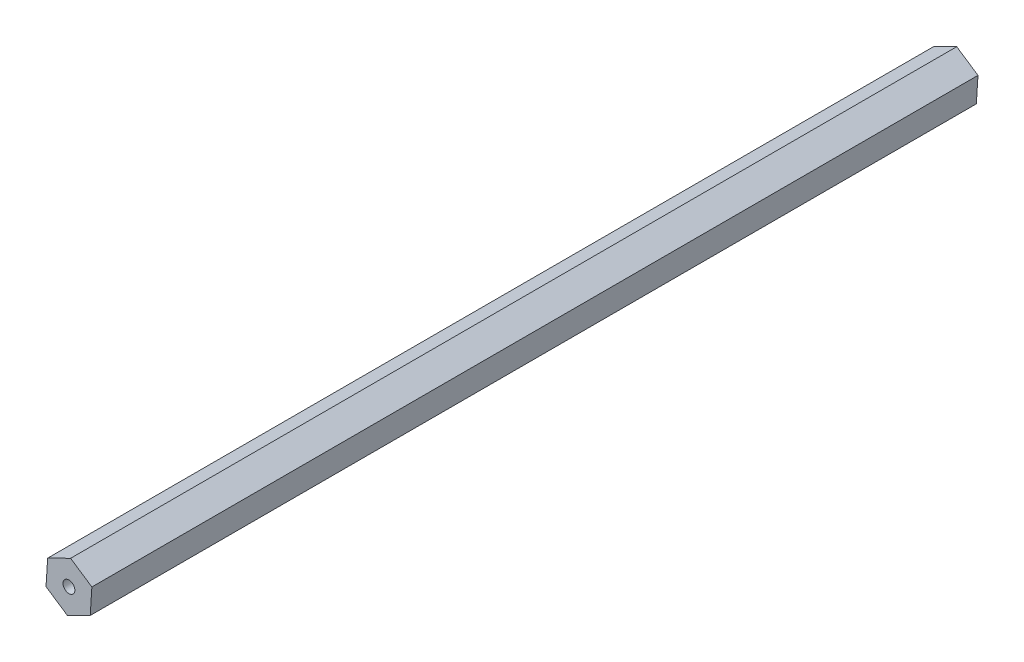
ISO-10303-21;
HEADER;
FILE_DESCRIPTION(('STEP AP214'),'2;1');
FILE_NAME('part.step','',(''),(''),'','','');
FILE_SCHEMA(('AUTOMOTIVE_DESIGN { 1 0 10303 214 1 1 1 1 }'));
ENDSEC;
DATA;
#1=APPLICATION_CONTEXT('core data for automotive mechanical design processes');
#2=APPLICATION_PROTOCOL_DEFINITION('international standard','automotive_design',2000,#1);
#3=PRODUCT_CONTEXT('',#1,'mechanical');
#4=PRODUCT('Part','Part','',(#3));
#5=PRODUCT_RELATED_PRODUCT_CATEGORY('part','',(#4));
#6=PRODUCT_DEFINITION_FORMATION('','',#4);
#7=PRODUCT_DEFINITION_CONTEXT('part definition',#1,'design');
#8=PRODUCT_DEFINITION('design','',#6,#7);
#9=PRODUCT_DEFINITION_SHAPE('','',#8);
#10=(LENGTH_UNIT() NAMED_UNIT(*) SI_UNIT(.MILLI.,.METRE.));
#11=(NAMED_UNIT(*) PLANE_ANGLE_UNIT() SI_UNIT($,.RADIAN.));
#12=(NAMED_UNIT(*) SI_UNIT($,.STERADIAN.) SOLID_ANGLE_UNIT());
#13=UNCERTAINTY_MEASURE_WITH_UNIT(LENGTH_MEASURE(1.E-05),#10,'distance_accuracy_value','');
#14=(GEOMETRIC_REPRESENTATION_CONTEXT(3) GLOBAL_UNCERTAINTY_ASSIGNED_CONTEXT((#13)) GLOBAL_UNIT_ASSIGNED_CONTEXT((#10,
#11,#12)) REPRESENTATION_CONTEXT('',''));
#15=CARTESIAN_POINT('',(0.,0.,0.));
#16=DIRECTION('',(0.,0.,1.));
#17=DIRECTION('',(1.,0.,0.));
#18=AXIS2_PLACEMENT_3D('',#15,#16,#17);
#19=CARTESIAN_POINT('',(0.,0.,300.));
#20=DIRECTION('',(0.,0.,-1.));
#21=DIRECTION('',(-1.,0.,0.));
#22=AXIS2_PLACEMENT_3D('',#19,#20,#21);
#23=CYLINDRICAL_SURFACE('',#22,2.);
#24=CARTESIAN_POINT('',(0.,0.,300.));
#25=DIRECTION('',(0.,0.,-1.));
#26=DIRECTION('',(-1.,0.,0.));
#27=AXIS2_PLACEMENT_3D('',#24,#25,#26);
#28=CIRCLE('',#27,2.);
#29=CARTESIAN_POINT('',(-2.,0.,300.));
#30=VERTEX_POINT('',#29);
#31=EDGE_CURVE('E98',#30,#30,#28,.T.);
#32=ORIENTED_EDGE('',*,*,#31,.F.);
#33=EDGE_LOOP('',(#32));
#34=FACE_BOUND('',#33,.T.);
#35=CARTESIAN_POINT('',(0.,0.,0.));
#36=DIRECTION('',(0.,0.,-1.));
#37=DIRECTION('',(-1.,0.,0.));
#38=AXIS2_PLACEMENT_3D('',#35,#36,#37);
#39=CIRCLE('',#38,2.);
#40=CARTESIAN_POINT('',(-2.,0.,0.));
#41=VERTEX_POINT('',#40);
#42=EDGE_CURVE('E20',#41,#41,#39,.T.);
#43=ORIENTED_EDGE('',*,*,#42,.T.);
#44=EDGE_LOOP('',(#43));
#45=FACE_BOUND('',#44,.T.);
#46=ADVANCED_FACE('F17',(#34,#45),#23,.F.);
#47=CARTESIAN_POINT('',(-7.765515754,-3.833636012,0.));
#48=DIRECTION('',(0.997886653761154,-0.0649786599228341,0.));
#49=DIRECTION('',(0.0649786599228341,0.997886653761154,0.));
#50=AXIS2_PLACEMENT_3D('',#47,#48,#49);
#51=PLANE('',#50);
#52=DIRECTION('',(-0.064978659977166,-0.997886653757616,0.));
#53=VECTOR('',#52,1.);
#54=CARTESIAN_POINT('',(-7.20278404931744,4.80831591617065,300.));
#55=LINE('',#54,#53);
#56=CARTESIAN_POINT('',(-7.20278405027703,4.80831591281217,300.));
#57=VERTEX_POINT('',#56);
#58=CARTESIAN_POINT('',(-7.76551575366513,-3.83363601404959,300.));
#59=VERTEX_POINT('',#58);
#60=EDGE_CURVE('E77',#57,#59,#55,.T.);
#61=ORIENTED_EDGE('',*,*,#60,.F.);
#62=DIRECTION('',(0.,0.,1.));
#63=VECTOR('',#62,1.);
#64=CARTESIAN_POINT('',(-7.20278404779069,4.80831591307803,0.));
#65=LINE('',#64,#63);
#66=CARTESIAN_POINT('',(-7.20278404989534,4.80831591203901,0.));
#67=VERTEX_POINT('',#66);
#68=EDGE_CURVE('E73',#57,#67,#65,.F.);
#69=ORIENTED_EDGE('',*,*,#68,.T.);
#70=DIRECTION('',(-0.0649786599228342,-0.997886653761154,0.));
#71=VECTOR('',#70,1.);
#72=CARTESIAN_POINT('',(-7.202784052,4.808315911,0.));
#73=LINE('',#72,#71);
#74=CARTESIAN_POINT('',(-7.76551575408766,-3.83363601334615,0.));
#75=VERTEX_POINT('',#74);
#76=EDGE_CURVE('E76',#67,#75,#73,.T.);
#77=ORIENTED_EDGE('',*,*,#76,.T.);
#78=DIRECTION('',(0.,0.,1.));
#79=VECTOR('',#78,1.);
#80=CARTESIAN_POINT('',(-7.765515754,-3.833636012,0.));
#81=LINE('',#80,#79);
#82=EDGE_CURVE('E67',#75,#59,#81,.T.);
#83=ORIENTED_EDGE('',*,*,#82,.T.);
#84=EDGE_LOOP('',(#61,#69,#77,#83));
#85=FACE_BOUND('',#84,.T.);
#86=ADVANCED_FACE('F75',(#85),#51,.F.);
#87=CARTESIAN_POINT('',(-0.562731702,-8.641951923,0.));
#88=DIRECTION('',(0.555216497113954,0.831705862268934,0.));
#89=DIRECTION('',(-0.831705862268934,0.555216497113954,0.));
#90=AXIS2_PLACEMENT_3D('',#87,#88,#89);
#91=PLANE('',#90);
#92=DIRECTION('',(0.831705862466919,-0.555216496817375,0.));
#93=VECTOR('',#92,1.);
#94=CARTESIAN_POINT('',(-7.76551575230988,-3.83363601481376,300.));
#95=LINE('',#94,#93);
#96=CARTESIAN_POINT('',(-0.562731703165504,-8.64195192171506,300.));
#97=VERTEX_POINT('',#96);
#98=EDGE_CURVE('E103',#59,#97,#95,.T.);
#99=ORIENTED_EDGE('',*,*,#98,.F.);
#100=ORIENTED_EDGE('',*,*,#82,.F.);
#101=DIRECTION('',(0.831705862268934,-0.555216497113954,0.));
#102=VECTOR('',#101,1.);
#103=CARTESIAN_POINT('',(-7.765515754,-3.833636012,0.));
#104=LINE('',#103,#102);
#105=CARTESIAN_POINT('',(-0.562731702466525,-8.64195192268856,0.));
#106=VERTEX_POINT('',#105);
#107=EDGE_CURVE('E89',#75,#106,#104,.T.);
#108=ORIENTED_EDGE('',*,*,#107,.T.);
#109=DIRECTION('',(0.,0.,1.));
#110=VECTOR('',#109,1.);
#111=CARTESIAN_POINT('',(-0.562731702000001,-8.641951923,0.));
#112=LINE('',#111,#110);
#113=EDGE_CURVE('E100',#106,#97,#112,.T.);
#114=ORIENTED_EDGE('',*,*,#113,.T.);
#115=EDGE_LOOP('',(#99,#100,#108,#114));
#116=FACE_BOUND('',#115,.T.);
#117=ADVANCED_FACE('F112',(#116),#91,.F.);
#118=CARTESIAN_POINT('',(-7.202784052,4.808315911,0.));
#119=DIRECTION('',(0.442670156706181,-0.896684522204842,0.));
#120=DIRECTION('',(0.896684522204842,0.442670156706181,0.));
#121=AXIS2_PLACEMENT_3D('',#118,#119,#120);
#122=PLANE('',#121);
#123=DIRECTION('',(-0.896684522523556,-0.442670156060585,0.));
#124=VECTOR('',#123,1.);
#125=CARTESIAN_POINT('',(0.562731702929822,8.64195192035174,300.));
#126=LINE('',#125,#124);
#127=CARTESIAN_POINT('',(0.562731702931435,8.64195192136443,300.));
#128=VERTEX_POINT('',#127);
#129=EDGE_CURVE('E130',#128,#57,#126,.T.);
#130=ORIENTED_EDGE('',*,*,#129,.F.);
#131=DIRECTION('',(0.,0.,1.));
#132=VECTOR('',#131,1.);
#133=CARTESIAN_POINT('',(0.562731703866094,8.64195192175426,0.));
#134=LINE('',#133,#132);
#135=CARTESIAN_POINT('',(0.562731702466526,8.64195192268856,0.));
#136=VERTEX_POINT('',#135);
#137=EDGE_CURVE('E93',#128,#136,#134,.F.);
#138=ORIENTED_EDGE('',*,*,#137,.T.);
#139=DIRECTION('',(-0.896684522204842,-0.442670156706181,0.));
#140=VECTOR('',#139,1.);
#141=CARTESIAN_POINT('',(0.562731702,8.641951923,0.));
#142=LINE('',#141,#140);
#143=EDGE_CURVE('E86',#136,#67,#142,.T.);
#144=ORIENTED_EDGE('',*,*,#143,.T.);
#145=ORIENTED_EDGE('',*,*,#68,.F.);
#146=EDGE_LOOP('',(#130,#138,#144,#145));
#147=FACE_BOUND('',#146,.T.);
#148=ADVANCED_FACE('F92',(#147),#122,.F.);
#149=CARTESIAN_POINT('',(-7.858701943,-8.745655346,0.));
#150=DIRECTION('',(0.,0.,1.));
#151=DIRECTION('',(1.,0.,0.));
#152=AXIS2_PLACEMENT_3D('',#149,#150,#151);
#153=PLANE('',#152);
#154=ORIENTED_EDGE('',*,*,#76,.F.);
#155=ORIENTED_EDGE('',*,*,#143,.F.);
#156=DIRECTION('',(0.831705862268934,-0.555216497113954,0.));
#157=VECTOR('',#156,1.);
#158=CARTESIAN_POINT('',(0.562731702,8.641951923,0.));
#159=LINE('',#158,#157);
#160=CARTESIAN_POINT('',(7.76551575404383,3.83363601267307,0.));
#161=VERTEX_POINT('',#160);
#162=EDGE_CURVE('E120',#136,#161,#159,.T.);
#163=ORIENTED_EDGE('',*,*,#162,.T.);
#164=DIRECTION('',(-0.0649786599228341,-0.997886653761154,0.));
#165=VECTOR('',#164,1.);
#166=CARTESIAN_POINT('',(7.765515754,3.833636012,0.));
#167=LINE('',#166,#165);
#168=CARTESIAN_POINT('',(7.20278405094767,-4.80831591151951,0.));
#169=VERTEX_POINT('',#168);
#170=EDGE_CURVE('E119',#161,#169,#167,.T.);
#171=ORIENTED_EDGE('',*,*,#170,.T.);
#172=DIRECTION('',(-0.896684522204842,-0.442670156706181,0.));
#173=VECTOR('',#172,1.);
#174=CARTESIAN_POINT('',(7.202784052,-4.808315911,0.));
#175=LINE('',#174,#173);
#176=EDGE_CURVE('E106',#169,#106,#175,.T.);
#177=ORIENTED_EDGE('',*,*,#176,.T.);
#178=ORIENTED_EDGE('',*,*,#107,.F.);
#179=EDGE_LOOP('',(#154,#155,#163,#171,#177,#178));
#180=FACE_BOUND('',#179,.T.);
#181=ORIENTED_EDGE('',*,*,#42,.F.);
#182=EDGE_LOOP('',(#181));
#183=FACE_BOUND('',#182,.T.);
#184=ADVANCED_FACE('F83',(#180,#183),#153,.F.);
#185=CARTESIAN_POINT('',(7.202784052,-4.808315911,0.));
#186=DIRECTION('',(-0.442670156706181,0.896684522204842,0.));
#187=DIRECTION('',(-0.896684522204842,-0.442670156706181,0.));
#188=AXIS2_PLACEMENT_3D('',#185,#186,#187);
#189=PLANE('',#188);
#190=DIRECTION('',(0.896684522523556,0.442670156060585,0.));
#191=VECTOR('',#190,1.);
#192=CARTESIAN_POINT('',(-0.562731702929822,-8.64195192035174,300.));
#193=LINE('',#192,#191);
#194=CARTESIAN_POINT('',(7.2027840492247,-4.80831591333168,300.));
#195=VERTEX_POINT('',#194);
#196=EDGE_CURVE('E117',#97,#195,#193,.T.);
#197=ORIENTED_EDGE('',*,*,#196,.F.);
#198=ORIENTED_EDGE('',*,*,#113,.F.);
#199=ORIENTED_EDGE('',*,*,#176,.F.);
#200=DIRECTION('',(0.,0.,1.));
#201=VECTOR('',#200,1.);
#202=CARTESIAN_POINT('',(7.202784052,-4.808315911,0.));
#203=LINE('',#202,#201);
#204=EDGE_CURVE('E122',#169,#195,#203,.T.);
#205=ORIENTED_EDGE('',*,*,#204,.T.);
#206=EDGE_LOOP('',(#197,#198,#199,#205));
#207=FACE_BOUND('',#206,.T.);
#208=ADVANCED_FACE('F114',(#207),#189,.F.);
#209=CARTESIAN_POINT('',(-7.858701943,-8.745655346,300.));
#210=DIRECTION('',(0.,0.,1.));
#211=DIRECTION('',(1.,0.,0.));
#212=AXIS2_PLACEMENT_3D('',#209,#210,#211);
#213=PLANE('',#212);
#214=DIRECTION('',(0.831705862268934,-0.555216497113954,0.));
#215=VECTOR('',#214,1.);
#216=CARTESIAN_POINT('',(0.562731702,8.641951923,300.));
#217=LINE('',#216,#215);
#218=CARTESIAN_POINT('',(7.76551575319877,3.83363601407995,300.));
#219=VERTEX_POINT('',#218);
#220=EDGE_CURVE('E34',#219,#128,#217,.F.);
#221=ORIENTED_EDGE('',*,*,#220,.T.);
#222=ORIENTED_EDGE('',*,*,#129,.T.);
#223=ORIENTED_EDGE('',*,*,#60,.T.);
#224=ORIENTED_EDGE('',*,*,#98,.T.);
#225=ORIENTED_EDGE('',*,*,#196,.T.);
#226=DIRECTION('',(-0.0649786599228341,-0.997886653761154,0.));
#227=VECTOR('',#226,1.);
#228=CARTESIAN_POINT('',(7.765515754,3.833636012,300.));
#229=LINE('',#228,#227);
#230=EDGE_CURVE('E26',#195,#219,#229,.F.);
#231=ORIENTED_EDGE('',*,*,#230,.T.);
#232=EDGE_LOOP('',(#221,#222,#223,#224,#225,#231));
#233=FACE_BOUND('',#232,.T.);
#234=ORIENTED_EDGE('',*,*,#31,.T.);
#235=EDGE_LOOP('',(#234));
#236=FACE_BOUND('',#235,.T.);
#237=ADVANCED_FACE('F133',(#233,#236),#213,.T.);
#238=CARTESIAN_POINT('',(0.562731702,8.641951923,0.));
#239=DIRECTION('',(-0.555216497113954,-0.831705862268934,0.));
#240=DIRECTION('',(0.831705862268934,-0.555216497113954,0.));
#241=AXIS2_PLACEMENT_3D('',#238,#239,#240);
#242=PLANE('',#241);
#243=ORIENTED_EDGE('',*,*,#220,.F.);
#244=DIRECTION('',(0.,0.,1.));
#245=VECTOR('',#244,1.);
#246=CARTESIAN_POINT('',(7.76551575417531,3.8336360146923,0.));
#247=LINE('',#246,#245);
#248=EDGE_CURVE('E11',#219,#161,#247,.F.);
#249=ORIENTED_EDGE('',*,*,#248,.T.);
#250=ORIENTED_EDGE('',*,*,#162,.F.);
#251=ORIENTED_EDGE('',*,*,#137,.F.);
#252=EDGE_LOOP('',(#243,#249,#250,#251));
#253=FACE_BOUND('',#252,.T.);
#254=ADVANCED_FACE('F136',(#253),#242,.F.);
#255=CARTESIAN_POINT('',(7.765515754,3.833636012,0.));
#256=DIRECTION('',(-0.997886653761154,0.0649786599228341,0.));
#257=DIRECTION('',(-0.0649786599228341,-0.997886653761154,0.));
#258=AXIS2_PLACEMENT_3D('',#255,#256,#257);
#259=PLANE('',#258);
#260=ORIENTED_EDGE('',*,*,#230,.F.);
#261=ORIENTED_EDGE('',*,*,#204,.F.);
#262=ORIENTED_EDGE('',*,*,#170,.F.);
#263=ORIENTED_EDGE('',*,*,#248,.F.);
#264=EDGE_LOOP('',(#260,#261,#262,#263));
#265=FACE_BOUND('',#264,.T.);
#266=ADVANCED_FACE('F137',(#265),#259,.F.);
#267=CLOSED_SHELL('',(#46,#86,#117,#148,#184,#208,#237,#254,#266));
#268=MANIFOLD_SOLID_BREP('B1',#267);
#269=ADVANCED_BREP_SHAPE_REPRESENTATION('',(#18,#268),#14);
#270=SHAPE_DEFINITION_REPRESENTATION(#9,#269);
ENDSEC;
END-ISO-10303-21;
